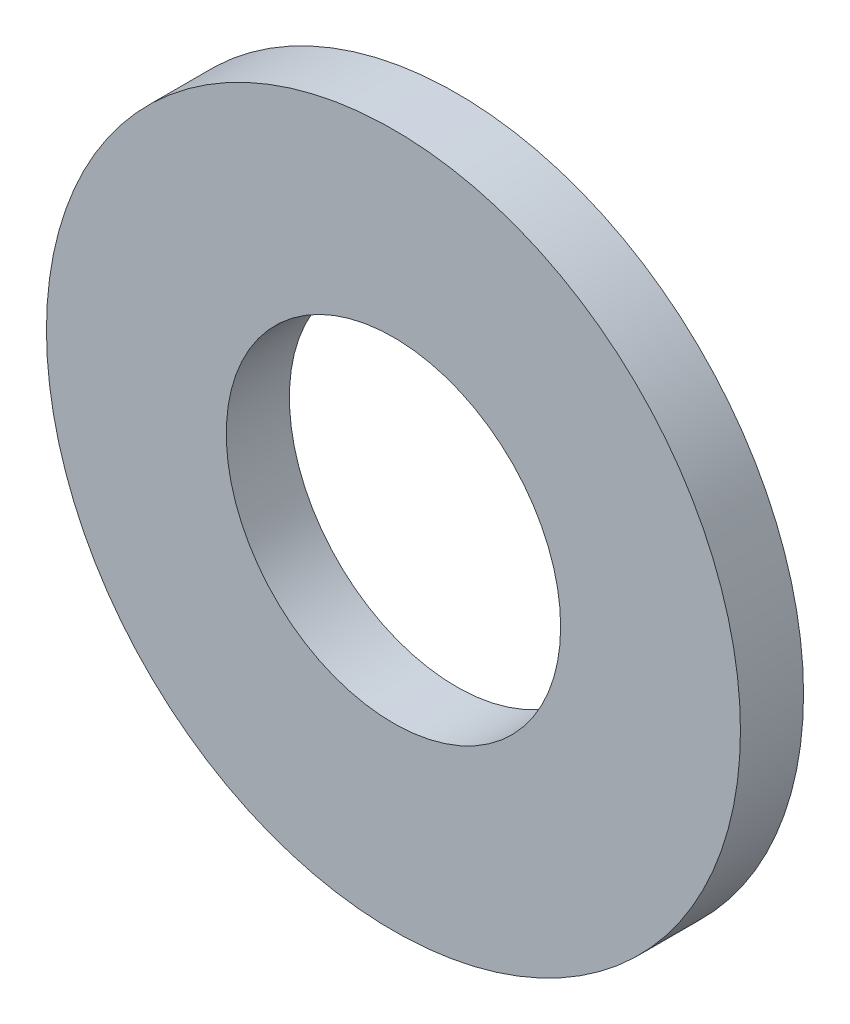
ISO-10303-21;
HEADER;
FILE_DESCRIPTION(('STEP AP214'),'2;1');
FILE_NAME('part.step','',(''),(''),'','','');
FILE_SCHEMA(('AUTOMOTIVE_DESIGN { 1 0 10303 214 1 1 1 1 }'));
ENDSEC;
DATA;
#1=APPLICATION_CONTEXT('core data for automotive mechanical design processes');
#2=APPLICATION_PROTOCOL_DEFINITION('international standard','automotive_design',2000,#1);
#3=PRODUCT_CONTEXT('',#1,'mechanical');
#4=PRODUCT('Part','Part','',(#3));
#5=PRODUCT_RELATED_PRODUCT_CATEGORY('part','',(#4));
#6=PRODUCT_DEFINITION_FORMATION('','',#4);
#7=PRODUCT_DEFINITION_CONTEXT('part definition',#1,'design');
#8=PRODUCT_DEFINITION('design','',#6,#7);
#9=PRODUCT_DEFINITION_SHAPE('','',#8);
#10=(LENGTH_UNIT() NAMED_UNIT(*) SI_UNIT(.MILLI.,.METRE.));
#11=(NAMED_UNIT(*) PLANE_ANGLE_UNIT() SI_UNIT($,.RADIAN.));
#12=(NAMED_UNIT(*) SI_UNIT($,.STERADIAN.) SOLID_ANGLE_UNIT());
#13=UNCERTAINTY_MEASURE_WITH_UNIT(LENGTH_MEASURE(1.E-05),#10,'distance_accuracy_value','');
#14=(GEOMETRIC_REPRESENTATION_CONTEXT(3) GLOBAL_UNCERTAINTY_ASSIGNED_CONTEXT((#13)) GLOBAL_UNIT_ASSIGNED_CONTEXT((#10,
#11,#12)) REPRESENTATION_CONTEXT('',''));
#15=CARTESIAN_POINT('',(0.,0.,0.));
#16=DIRECTION('',(0.,0.,1.));
#17=DIRECTION('',(1.,0.,0.));
#18=AXIS2_PLACEMENT_3D('',#15,#16,#17);
#19=CARTESIAN_POINT('',(0.,0.,1.));
#20=DIRECTION('',(0.,0.,1.));
#21=DIRECTION('',(1.,0.,0.));
#22=AXIS2_PLACEMENT_3D('',#19,#20,#21);
#23=PLANE('',#22);
#24=CARTESIAN_POINT('',(0.,0.,1.));
#25=DIRECTION('',(0.,0.,1.));
#26=DIRECTION('',(1.,0.,0.));
#27=AXIS2_PLACEMENT_3D('',#24,#25,#26);
#28=CIRCLE('',#27,5.5);
#29=CARTESIAN_POINT('',(5.5,0.,1.));
#30=VERTEX_POINT('',#29);
#31=EDGE_CURVE('E10',#30,#30,#28,.T.);
#32=ORIENTED_EDGE('',*,*,#31,.T.);
#33=EDGE_LOOP('',(#32));
#34=FACE_BOUND('',#33,.T.);
#35=CARTESIAN_POINT('',(0.,0.,1.));
#36=DIRECTION('',(0.,0.,1.));
#37=DIRECTION('',(1.,0.,0.));
#38=AXIS2_PLACEMENT_3D('',#35,#36,#37);
#39=CIRCLE('',#38,2.65);
#40=CARTESIAN_POINT('',(2.65,0.,1.));
#41=VERTEX_POINT('',#40);
#42=EDGE_CURVE('E44',#41,#41,#39,.T.);
#43=ORIENTED_EDGE('',*,*,#42,.F.);
#44=EDGE_LOOP('',(#43));
#45=FACE_BOUND('',#44,.T.);
#46=ADVANCED_FACE('F33',(#34,#45),#23,.T.);
#47=CARTESIAN_POINT('',(0.,0.,0.));
#48=DIRECTION('',(0.,0.,1.));
#49=DIRECTION('',(1.,0.,0.));
#50=AXIS2_PLACEMENT_3D('',#47,#48,#49);
#51=PLANE('',#50);
#52=CARTESIAN_POINT('',(0.,0.,0.));
#53=DIRECTION('',(0.,0.,1.));
#54=DIRECTION('',(1.,0.,0.));
#55=AXIS2_PLACEMENT_3D('',#52,#53,#54);
#56=CIRCLE('',#55,5.5);
#57=CARTESIAN_POINT('',(5.5,0.,0.));
#58=VERTEX_POINT('',#57);
#59=EDGE_CURVE('E37',#58,#58,#56,.T.);
#60=ORIENTED_EDGE('',*,*,#59,.F.);
#61=EDGE_LOOP('',(#60));
#62=FACE_BOUND('',#61,.T.);
#63=CARTESIAN_POINT('',(0.,0.,0.));
#64=DIRECTION('',(0.,0.,1.));
#65=DIRECTION('',(1.,0.,0.));
#66=AXIS2_PLACEMENT_3D('',#63,#64,#65);
#67=CIRCLE('',#66,2.65);
#68=CARTESIAN_POINT('',(2.65,0.,0.));
#69=VERTEX_POINT('',#68);
#70=EDGE_CURVE('E46',#69,#69,#67,.T.);
#71=ORIENTED_EDGE('',*,*,#70,.T.);
#72=EDGE_LOOP('',(#71));
#73=FACE_BOUND('',#72,.T.);
#74=ADVANCED_FACE('F56',(#62,#73),#51,.F.);
#75=CARTESIAN_POINT('',(0.,0.,1.));
#76=DIRECTION('',(0.,0.,-1.));
#77=DIRECTION('',(-1.,0.,0.));
#78=AXIS2_PLACEMENT_3D('',#75,#76,#77);
#79=CYLINDRICAL_SURFACE('',#78,5.5);
#80=ORIENTED_EDGE('',*,*,#31,.F.);
#81=EDGE_LOOP('',(#80));
#82=FACE_BOUND('',#81,.T.);
#83=ORIENTED_EDGE('',*,*,#59,.T.);
#84=EDGE_LOOP('',(#83));
#85=FACE_BOUND('',#84,.T.);
#86=ADVANCED_FACE('F35',(#82,#85),#79,.T.);
#87=CARTESIAN_POINT('',(0.,0.,1.));
#88=DIRECTION('',(0.,0.,-1.));
#89=DIRECTION('',(-1.,0.,0.));
#90=AXIS2_PLACEMENT_3D('',#87,#88,#89);
#91=CYLINDRICAL_SURFACE('',#90,2.65);
#92=ORIENTED_EDGE('',*,*,#42,.T.);
#93=EDGE_LOOP('',(#92));
#94=FACE_BOUND('',#93,.T.);
#95=ORIENTED_EDGE('',*,*,#70,.F.);
#96=EDGE_LOOP('',(#95));
#97=FACE_BOUND('',#96,.T.);
#98=ADVANCED_FACE('F52',(#94,#97),#91,.F.);
#99=CLOSED_SHELL('',(#46,#74,#86,#98));
#100=MANIFOLD_SOLID_BREP('B2',#99);
#101=ADVANCED_BREP_SHAPE_REPRESENTATION('',(#18,#100),#14);
#102=SHAPE_DEFINITION_REPRESENTATION(#9,#101);
ENDSEC;
END-ISO-10303-21;
